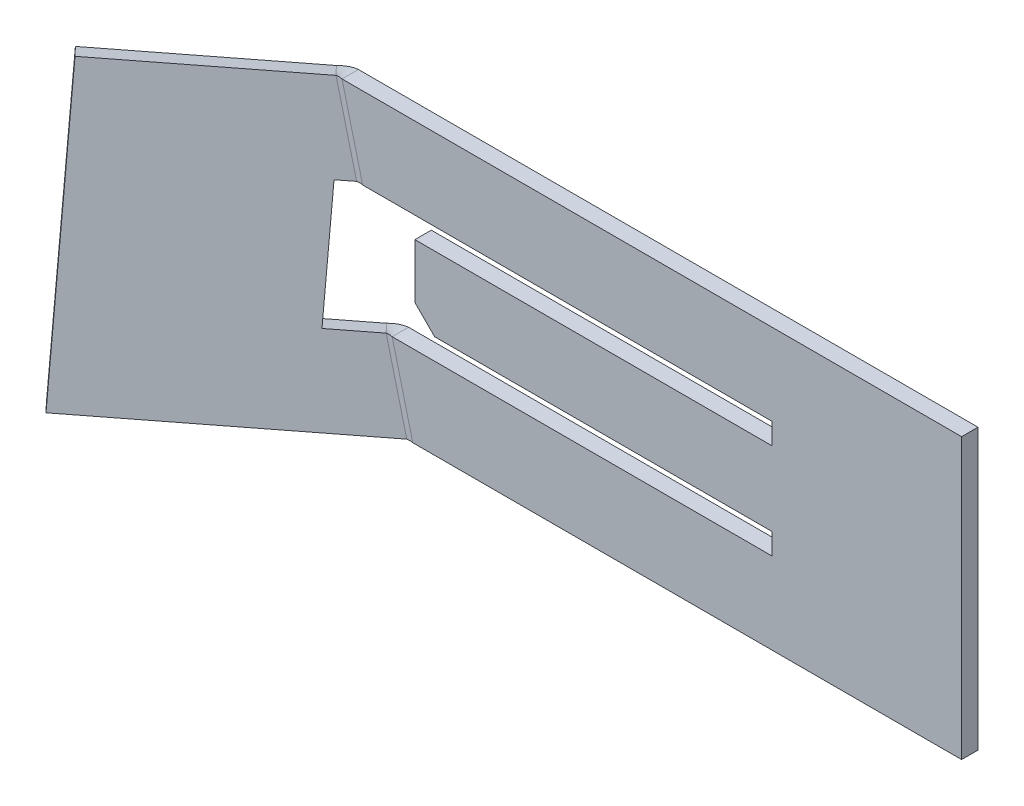
ISO-10303-21;
HEADER;
FILE_DESCRIPTION(('STEP AP214'),'2;1');
FILE_NAME('part.step','',(''),(''),'','','');
FILE_SCHEMA(('AUTOMOTIVE_DESIGN { 1 0 10303 214 1 1 1 1 }'));
ENDSEC;
DATA;
#1=APPLICATION_CONTEXT('core data for automotive mechanical design processes');
#2=APPLICATION_PROTOCOL_DEFINITION('international standard','automotive_design',2000,#1);
#3=PRODUCT_CONTEXT('',#1,'mechanical');
#4=PRODUCT('Part','Part','',(#3));
#5=PRODUCT_RELATED_PRODUCT_CATEGORY('part','',(#4));
#6=PRODUCT_DEFINITION_FORMATION('','',#4);
#7=PRODUCT_DEFINITION_CONTEXT('part definition',#1,'design');
#8=PRODUCT_DEFINITION('design','',#6,#7);
#9=PRODUCT_DEFINITION_SHAPE('','',#8);
#10=(LENGTH_UNIT() NAMED_UNIT(*) SI_UNIT(.MILLI.,.METRE.));
#11=(NAMED_UNIT(*) PLANE_ANGLE_UNIT() SI_UNIT($,.RADIAN.));
#12=(NAMED_UNIT(*) SI_UNIT($,.STERADIAN.) SOLID_ANGLE_UNIT());
#13=UNCERTAINTY_MEASURE_WITH_UNIT(LENGTH_MEASURE(1.E-05),#10,'distance_accuracy_value','');
#14=(GEOMETRIC_REPRESENTATION_CONTEXT(3) GLOBAL_UNCERTAINTY_ASSIGNED_CONTEXT((#13)) GLOBAL_UNIT_ASSIGNED_CONTEXT((#10,
#11,#12)) REPRESENTATION_CONTEXT('',''));
#15=CARTESIAN_POINT('',(0.,0.,0.));
#16=DIRECTION('',(0.,0.,1.));
#17=DIRECTION('',(1.,0.,0.));
#18=AXIS2_PLACEMENT_3D('',#15,#16,#17);
#19=CARTESIAN_POINT('',(45.5954464902255,-32.9383531907822,-72.0643373442726));
#20=DIRECTION('',(0.0696483479716061,-0.98237775564722,0.17344466793291));
#21=DIRECTION('',(-0.685504884859068,-0.17344466793291,-0.707106781186546));
#22=AXIS2_PLACEMENT_3D('',#19,#20,#21);
#23=PLANE('',#22);
#24=DIRECTION('',(0.724729025539327,-0.0696483479716061,-0.685504884859068));
#25=VECTOR('',#24,1.);
#26=CARTESIAN_POINT('',(45.5954464902255,-32.9383531907822,-72.0643373442726));
#27=LINE('',#26,#25);
#28=CARTESIAN_POINT('',(-62.5889850948799,-22.5415473907901,30.264883238693));
#29=VERTEX_POINT('',#28);
#30=CARTESIAN_POINT('',(-28.6593165254018,-25.8022769597896,-1.82842712474618));
#31=VERTEX_POINT('',#30);
#32=EDGE_CURVE('E683',#29,#31,#27,.T.);
#33=ORIENTED_EDGE('',*,*,#32,.T.);
#34=CARTESIAN_POINT('',(-26.6028018708245,-25.2819429559909,0.29289321881346));
#35=CARTESIAN_POINT('',(-28.6593165254018,-25.8022769597896,-1.82842712474616));
#36=B_SPLINE_CURVE_WITH_KNOTS('',1,(#34,#35),.UNSPECIFIED.,.F.,.F.,(2,2),(0.,1.),.UNSPECIFIED.);
#37=CARTESIAN_POINT('',(-26.6028018708246,-25.2819429559909,0.292893218813456));
#38=VERTEX_POINT('',#37);
#39=EDGE_CURVE('E247',#31,#38,#36,.F.);
#40=ORIENTED_EDGE('',*,*,#39,.T.);
#41=DIRECTION('',(0.724729025539327,-0.0696483479716061,-0.685504884859068));
#42=VECTOR('',#41,1.);
#43=CARTESIAN_POINT('',(47.6519611448028,-32.4180191869834,-69.943017000713));
#44=LINE('',#43,#42);
#45=CARTESIAN_POINT('',(-60.5324704403027,-22.0212133869914,32.3862035822526));
#46=VERTEX_POINT('',#45);
#47=EDGE_CURVE('E235',#46,#38,#44,.T.);
#48=ORIENTED_EDGE('',*,*,#47,.F.);
#49=DIRECTION('',(0.685504884859068,0.17344466793291,0.707106781186546));
#50=VECTOR('',#49,1.);
#51=CARTESIAN_POINT('',(-62.5889850948799,-22.5415473907901,30.264883238693));
#52=LINE('',#51,#50);
#53=EDGE_CURVE('E685',#29,#46,#52,.T.);
#54=ORIENTED_EDGE('',*,*,#53,.F.);
#55=EDGE_LOOP('',(#33,#40,#48,#54));
#56=FACE_BOUND('',#55,.T.);
#57=ADVANCED_FACE('F69',(#56),#23,.T.);
#58=CARTESIAN_POINT('',(42.0308273587997,17.3399756433038,-80.941276992712));
#59=DIRECTION('',(-0.0696483479716061,0.98237775564722,-0.17344466793291));
#60=DIRECTION('',(0.685504884859068,0.17344466793291,0.707106781186546));
#61=AXIS2_PLACEMENT_3D('',#58,#59,#60);
#62=PLANE('',#61);
#63=DIRECTION('',(-0.724729025539327,0.0696483479716061,0.685504884859068));
#64=VECTOR('',#63,1.);
#65=CARTESIAN_POINT('',(44.0873420133769,17.8603096471025,-78.8199566491523));
#66=LINE('',#65,#64);
#67=CARTESIAN_POINT('',(-39.5522933252354,25.8982965649672,0.292893218813449));
#68=VERTEX_POINT('',#67);
#69=CARTESIAN_POINT('',(-64.0970895717285,28.2571154470945,23.5092639338132));
#70=VERTEX_POINT('',#69);
#71=EDGE_CURVE('E95',#68,#70,#66,.T.);
#72=ORIENTED_EDGE('',*,*,#71,.F.);
#73=CARTESIAN_POINT('',(-41.6088079798126,25.3779625611684,-1.82842712474618));
#74=CARTESIAN_POINT('',(-39.5522933252354,25.8982965649672,0.292893218813455));
#75=B_SPLINE_CURVE_WITH_KNOTS('',1,(#73,#74),.UNSPECIFIED.,.F.,.F.,(2,2),(0.,1.),.UNSPECIFIED.);
#76=CARTESIAN_POINT('',(-41.6088079798126,25.3779625611684,-1.82842712474618));
#77=VERTEX_POINT('',#76);
#78=EDGE_CURVE('E213',#68,#77,#75,.F.);
#79=ORIENTED_EDGE('',*,*,#78,.T.);
#80=DIRECTION('',(-0.724729025539327,0.0696483479716061,0.685504884859068));
#81=VECTOR('',#80,1.);
#82=CARTESIAN_POINT('',(42.0308273587997,17.3399756433038,-80.941276992712));
#83=LINE('',#82,#81);
#84=CARTESIAN_POINT('',(-66.1536042263057,27.7367814432958,21.3879435902536));
#85=VERTEX_POINT('',#84);
#86=EDGE_CURVE('E217',#77,#85,#83,.T.);
#87=ORIENTED_EDGE('',*,*,#86,.T.);
#88=DIRECTION('',(0.685504884859068,0.17344466793291,0.707106781186546));
#89=VECTOR('',#88,1.);
#90=CARTESIAN_POINT('',(-66.1536042263057,27.7367814432958,21.3879435902536));
#91=LINE('',#90,#89);
#92=EDGE_CURVE('E688',#85,#70,#91,.T.);
#93=ORIENTED_EDGE('',*,*,#92,.T.);
#94=EDGE_LOOP('',(#72,#79,#87,#93));
#95=FACE_BOUND('',#94,.T.);
#96=ADVANCED_FACE('F216',(#95),#62,.T.);
#97=CARTESIAN_POINT('',(-8.22256421346288,-2.08045186994445,-23.2168765334499));
#98=DIRECTION('',(0.685504884859068,0.17344466793291,0.707106781186546));
#99=DIRECTION('',(0.724729025539327,-0.0696483479716061,-0.685504884859068));
#100=AXIS2_PLACEMENT_3D('',#97,#98,#99);
#101=PLANE('',#100);
#102=ORIENTED_EDGE('',*,*,#47,.T.);
#103=DIRECTION('',(-0.245287801712019,0.969450305240699,0.));
#104=VECTOR('',#103,1.);
#105=CARTESIAN_POINT('',(-31.014117675933,-7.84711161123281,0.292893218813463));
#106=LINE('',#105,#104);
#107=CARTESIAN_POINT('',(-30.377319131409,-10.3639287503518,0.292893218813452));
#108=VERTEX_POINT('',#107);
#109=EDGE_CURVE('E712',#38,#108,#106,.T.);
#110=ORIENTED_EDGE('',*,*,#109,.T.);
#111=DIRECTION('',(0.724729025539327,-0.0696483479716061,-0.685504884859068));
#112=VECTOR('',#111,1.);
#113=CARTESIAN_POINT('',(21.4565884000965,-15.3453023413926,-48.7356340817702));
#114=LINE('',#113,#112);
#115=CARTESIAN_POINT('',(-36.4151277844758,-9.783679604484,6.00392062307883));
#116=VERTEX_POINT('',#115);
#117=EDGE_CURVE('E696',#116,#108,#114,.T.);
#118=ORIENTED_EDGE('',*,*,#117,.F.);
#119=DIRECTION('',(0.0696483479716061,-0.98237775564722,0.17344466793291));
#120=VECTOR('',#119,1.);
#121=CARTESIAN_POINT('',(-36.4151277844758,-9.783679604484,6.00392062307883));
#122=LINE('',#121,#120);
#123=CARTESIAN_POINT('',(-37.9017168270222,11.1843986015037,2.30188101487048));
#124=VERTEX_POINT('',#123);
#125=EDGE_CURVE('E664',#124,#116,#122,.T.);
#126=ORIENTED_EDGE('',*,*,#125,.F.);
#127=DIRECTION('',(-0.724729025539327,0.0696483479716061,0.685504884859068));
#128=VECTOR('',#127,1.);
#129=CARTESIAN_POINT('',(19.9699993575501,5.6227758645951,-52.4376736899786));
#130=LINE('',#129,#128);
#131=CARTESIAN_POINT('',(-35.777776064651,10.980282359328,0.292893218813456));
#132=VERTEX_POINT('',#131);
#133=EDGE_CURVE('E87',#132,#124,#130,.T.);
#134=ORIENTED_EDGE('',*,*,#133,.F.);
#135=DIRECTION('',(-0.245287801712019,0.969450305240699,0.));
#136=VECTOR('',#135,1.);
#137=CARTESIAN_POINT('',(-31.014117675933,-7.84711161123281,0.292893218813463));
#138=LINE('',#137,#136);
#139=EDGE_CURVE('E80',#132,#68,#138,.T.);
#140=ORIENTED_EDGE('',*,*,#139,.T.);
#141=ORIENTED_EDGE('',*,*,#71,.T.);
#142=DIRECTION('',(0.0696483479716061,-0.98237775564722,0.17344466793291));
#143=VECTOR('',#142,1.);
#144=CARTESIAN_POINT('',(-60.5324704403027,-22.0212133869914,32.3862035822526));
#145=LINE('',#144,#143);
#146=EDGE_CURVE('E667',#70,#46,#145,.T.);
#147=ORIENTED_EDGE('',*,*,#146,.T.);
#148=EDGE_LOOP('',(#102,#110,#118,#126,#134,#140,#141,#147));
#149=FACE_BOUND('',#148,.T.);
#150=ADVANCED_FACE('F641',(#149),#101,.T.);
#151=CARTESIAN_POINT('',(-62.5889850948799,-22.5415473907901,30.264883238693));
#152=DIRECTION('',(-0.724729025539327,0.0696483479716061,0.685504884859068));
#153=DIRECTION('',(0.685504884859068,0.17344466793291,0.707106781186546));
#154=AXIS2_PLACEMENT_3D('',#151,#152,#153);
#155=PLANE('',#154);
#156=ORIENTED_EDGE('',*,*,#146,.F.);
#157=ORIENTED_EDGE('',*,*,#92,.F.);
#158=DIRECTION('',(0.0696483479716061,-0.98237775564722,0.17344466793291));
#159=VECTOR('',#158,1.);
#160=CARTESIAN_POINT('',(-62.5889850948799,-22.5415473907901,30.264883238693));
#161=LINE('',#160,#159);
#162=EDGE_CURVE('E234',#85,#29,#161,.T.);
#163=ORIENTED_EDGE('',*,*,#162,.T.);
#164=ORIENTED_EDGE('',*,*,#53,.T.);
#165=EDGE_LOOP('',(#156,#157,#163,#164));
#166=FACE_BOUND('',#165,.T.);
#167=ADVANCED_FACE('F638',(#166),#155,.T.);
#168=CARTESIAN_POINT('',(-10.2790788680401,-2.60078587374318,-25.3381968770095));
#169=DIRECTION('',(0.685504884859068,0.17344466793291,0.707106781186546));
#170=DIRECTION('',(0.724729025539327,-0.0696483479716061,-0.685504884859068));
#171=AXIS2_PLACEMENT_3D('',#168,#169,#170);
#172=PLANE('',#171);
#173=DIRECTION('',(-0.245287801712019,0.969450305240699,0.));
#174=VECTOR('',#173,1.);
#175=CARTESIAN_POINT('',(-33.0706323305103,-8.36744561503154,-1.82842712474618));
#176=LINE('',#175,#174);
#177=CARTESIAN_POINT('',(-32.4338337859862,-10.8842627541505,-1.82842712474616));
#178=VERTEX_POINT('',#177);
#179=EDGE_CURVE('E687',#31,#178,#176,.T.);
#180=ORIENTED_EDGE('',*,*,#179,.F.);
#181=ORIENTED_EDGE('',*,*,#32,.F.);
#182=ORIENTED_EDGE('',*,*,#162,.F.);
#183=ORIENTED_EDGE('',*,*,#86,.F.);
#184=DIRECTION('',(-0.245287801712019,0.969450305240699,0.));
#185=VECTOR('',#184,1.);
#186=CARTESIAN_POINT('',(-33.0706323305103,-8.36744561503154,-1.82842712474618));
#187=LINE('',#186,#185);
#188=CARTESIAN_POINT('',(-37.8342907192282,10.4599483555293,-1.82842712474618));
#189=VERTEX_POINT('',#188);
#190=EDGE_CURVE('E224',#189,#77,#187,.T.);
#191=ORIENTED_EDGE('',*,*,#190,.F.);
#192=DIRECTION('',(-0.724729025539327,0.0696483479716061,0.685504884859068));
#193=VECTOR('',#192,1.);
#194=CARTESIAN_POINT('',(17.9134847029729,5.10244186079637,-54.5589940335382));
#195=LINE('',#194,#193);
#196=CARTESIAN_POINT('',(-39.9582314815994,10.664064597705,0.180560671310843));
#197=VERTEX_POINT('',#196);
#198=EDGE_CURVE('E694',#189,#197,#195,.T.);
#199=ORIENTED_EDGE('',*,*,#198,.T.);
#200=DIRECTION('',(0.0696483479716061,-0.98237775564722,0.17344466793291));
#201=VECTOR('',#200,1.);
#202=CARTESIAN_POINT('',(-38.471642439053,-10.3040136082827,3.88260027951919));
#203=LINE('',#202,#201);
#204=CARTESIAN_POINT('',(-38.471642439053,-10.3040136082827,3.88260027951919));
#205=VERTEX_POINT('',#204);
#206=EDGE_CURVE('E695',#197,#205,#203,.T.);
#207=ORIENTED_EDGE('',*,*,#206,.T.);
#208=DIRECTION('',(0.724729025539327,-0.0696483479716061,-0.685504884859068));
#209=VECTOR('',#208,1.);
#210=CARTESIAN_POINT('',(19.4000737455193,-15.8656363451913,-50.8569544253299));
#211=LINE('',#210,#209);
#212=EDGE_CURVE('E678',#205,#178,#211,.T.);
#213=ORIENTED_EDGE('',*,*,#212,.T.);
#214=EDGE_LOOP('',(#180,#181,#182,#183,#191,#199,#207,#213));
#215=FACE_BOUND('',#214,.T.);
#216=ADVANCED_FACE('F230',(#215),#172,.F.);
#217=CARTESIAN_POINT('',(19.4000737455193,-15.8656363451913,-50.8569544253299));
#218=DIRECTION('',(0.0696483479716061,-0.98237775564722,0.17344466793291));
#219=DIRECTION('',(-0.685504884859068,-0.17344466793291,-0.707106781186546));
#220=AXIS2_PLACEMENT_3D('',#217,#218,#219);
#221=PLANE('',#220);
#222=CARTESIAN_POINT('',(-32.4338337859862,-10.8842627541505,-1.82842712474617));
#223=CARTESIAN_POINT('',(-30.377319131409,-10.3639287503518,0.292893218813458));
#224=B_SPLINE_CURVE_WITH_KNOTS('',1,(#222,#223),.UNSPECIFIED.,.F.,.F.,(2,2),(0.,1.),.UNSPECIFIED.);
#225=EDGE_CURVE('E709',#178,#108,#224,.T.);
#226=ORIENTED_EDGE('',*,*,#225,.F.);
#227=ORIENTED_EDGE('',*,*,#212,.F.);
#228=DIRECTION('',(0.685504884859068,0.17344466793291,0.707106781186546));
#229=VECTOR('',#228,1.);
#230=CARTESIAN_POINT('',(-38.471642439053,-10.3040136082827,3.88260027951919));
#231=LINE('',#230,#229);
#232=EDGE_CURVE('E668',#205,#116,#231,.T.);
#233=ORIENTED_EDGE('',*,*,#232,.T.);
#234=ORIENTED_EDGE('',*,*,#117,.T.);
#235=EDGE_LOOP('',(#226,#227,#233,#234));
#236=FACE_BOUND('',#235,.T.);
#237=ADVANCED_FACE('F636',(#236),#221,.F.);
#238=CARTESIAN_POINT('',(-38.471642439053,-10.3040136082827,3.88260027951919));
#239=DIRECTION('',(-0.724729025539327,0.0696483479716061,0.685504884859068));
#240=DIRECTION('',(0.685504884859068,0.17344466793291,0.707106781186546));
#241=AXIS2_PLACEMENT_3D('',#238,#239,#240);
#242=PLANE('',#241);
#243=ORIENTED_EDGE('',*,*,#125,.T.);
#244=ORIENTED_EDGE('',*,*,#232,.F.);
#245=ORIENTED_EDGE('',*,*,#206,.F.);
#246=DIRECTION('',(0.685504884859068,0.17344466793291,0.707106781186546));
#247=VECTOR('',#246,1.);
#248=CARTESIAN_POINT('',(-39.9582314815994,10.664064597705,0.180560671310843));
#249=LINE('',#248,#247);
#250=EDGE_CURVE('E672',#197,#124,#249,.T.);
#251=ORIENTED_EDGE('',*,*,#250,.T.);
#252=EDGE_LOOP('',(#243,#244,#245,#251));
#253=FACE_BOUND('',#252,.T.);
#254=ADVANCED_FACE('F632',(#253),#242,.F.);
#255=CARTESIAN_POINT('',(17.9134847029729,5.10244186079637,-54.5589940335382));
#256=DIRECTION('',(-0.0696483479716061,0.98237775564722,-0.17344466793291));
#257=DIRECTION('',(0.685504884859068,0.17344466793291,0.707106781186546));
#258=AXIS2_PLACEMENT_3D('',#255,#256,#257);
#259=PLANE('',#258);
#260=CARTESIAN_POINT('',(-35.7777760646509,10.980282359328,0.292893218813459));
#261=CARTESIAN_POINT('',(-37.8342907192282,10.4599483555293,-1.82842712474616));
#262=B_SPLINE_CURVE_WITH_KNOTS('',1,(#260,#261),.UNSPECIFIED.,.F.,.F.,(2,2),(0.,1.),.UNSPECIFIED.);
#263=EDGE_CURVE('E12',#132,#189,#262,.T.);
#264=ORIENTED_EDGE('',*,*,#263,.F.);
#265=ORIENTED_EDGE('',*,*,#133,.T.);
#266=ORIENTED_EDGE('',*,*,#250,.F.);
#267=ORIENTED_EDGE('',*,*,#198,.F.);
#268=EDGE_LOOP('',(#264,#265,#266,#267));
#269=FACE_BOUND('',#268,.T.);
#270=ADVANCED_FACE('F635',(#269),#259,.F.);
#271=CARTESIAN_POINT('',(74.6378493013972,-25.590119760479,-3.));
#272=DIRECTION('',(1.,0.,0.));
#273=DIRECTION('',(0.,0.,-1.));
#274=AXIS2_PLACEMENT_3D('',#271,#272,#273);
#275=PLANE('',#274);
#276=DIRECTION('',(0.,1.,0.));
#277=VECTOR('',#276,1.);
#278=CARTESIAN_POINT('',(74.6378493013972,-25.590119760479,0.));
#279=LINE('',#278,#277);
#280=CARTESIAN_POINT('',(74.6378493013972,-25.590119760479,0.));
#281=VERTEX_POINT('',#280);
#282=CARTESIAN_POINT('',(74.6378493013972,25.590119760479,0.));
#283=VERTEX_POINT('',#282);
#284=EDGE_CURVE('E470',#281,#283,#279,.T.);
#285=ORIENTED_EDGE('',*,*,#284,.F.);
#286=DIRECTION('',(0.,0.,1.));
#287=VECTOR('',#286,1.);
#288=CARTESIAN_POINT('',(74.6378493013972,-25.590119760479,-3.));
#289=LINE('',#288,#287);
#290=CARTESIAN_POINT('',(74.6378493013972,-25.590119760479,-3.));
#291=VERTEX_POINT('',#290);
#292=EDGE_CURVE('E465',#291,#281,#289,.T.);
#293=ORIENTED_EDGE('',*,*,#292,.F.);
#294=DIRECTION('',(0.,1.,0.));
#295=VECTOR('',#294,1.);
#296=CARTESIAN_POINT('',(74.6378493013972,-25.590119760479,-3.));
#297=LINE('',#296,#295);
#298=CARTESIAN_POINT('',(74.6378493013972,25.590119760479,-3.));
#299=VERTEX_POINT('',#298);
#300=EDGE_CURVE('E529',#291,#299,#297,.T.);
#301=ORIENTED_EDGE('',*,*,#300,.T.);
#302=DIRECTION('',(0.,0.,1.));
#303=VECTOR('',#302,1.);
#304=CARTESIAN_POINT('',(74.6378493013972,25.590119760479,-3.));
#305=LINE('',#304,#303);
#306=EDGE_CURVE('E527',#299,#283,#305,.T.);
#307=ORIENTED_EDGE('',*,*,#306,.T.);
#308=EDGE_LOOP('',(#285,#293,#301,#307));
#309=FACE_BOUND('',#308,.T.);
#310=ADVANCED_FACE('F414',(#309),#275,.T.);
#311=CARTESIAN_POINT('',(39.9264512287923,6.79196508268892,-3.));
#312=DIRECTION('',(1.,0.,0.));
#313=DIRECTION('',(0.,1.,0.));
#314=AXIS2_PLACEMENT_3D('',#311,#312,#313);
#315=PLANE('',#314);
#316=DIRECTION('',(0.,1.,0.));
#317=VECTOR('',#316,1.);
#318=CARTESIAN_POINT('',(39.9264512287923,6.79196508268892,0.));
#319=LINE('',#318,#317);
#320=CARTESIAN_POINT('',(39.9264512287923,6.79196508268892,0.));
#321=VERTEX_POINT('',#320);
#322=CARTESIAN_POINT('',(39.9264512287924,10.6721055548399,0.));
#323=VERTEX_POINT('',#322);
#324=EDGE_CURVE('E524',#321,#323,#319,.T.);
#325=ORIENTED_EDGE('',*,*,#324,.T.);
#326=DIRECTION('',(0.,0.,1.));
#327=VECTOR('',#326,1.);
#328=CARTESIAN_POINT('',(39.9264512287924,10.6721055548399,-3.));
#329=LINE('',#328,#327);
#330=CARTESIAN_POINT('',(39.9264512287924,10.6721055548399,-3.));
#331=VERTEX_POINT('',#330);
#332=EDGE_CURVE('E458',#331,#323,#329,.T.);
#333=ORIENTED_EDGE('',*,*,#332,.F.);
#334=DIRECTION('',(0.,1.,0.));
#335=VECTOR('',#334,1.);
#336=CARTESIAN_POINT('',(39.9264512287923,6.79196508268892,-3.));
#337=LINE('',#336,#335);
#338=CARTESIAN_POINT('',(39.9264512287923,6.79196508268892,-3.));
#339=VERTEX_POINT('',#338);
#340=EDGE_CURVE('E475',#339,#331,#337,.T.);
#341=ORIENTED_EDGE('',*,*,#340,.F.);
#342=DIRECTION('',(0.,0.,1.));
#343=VECTOR('',#342,1.);
#344=CARTESIAN_POINT('',(39.9264512287923,6.79196508268892,-3.));
#345=LINE('',#344,#343);
#346=EDGE_CURVE('E521',#339,#321,#345,.T.);
#347=ORIENTED_EDGE('',*,*,#346,.T.);
#348=EDGE_LOOP('',(#325,#333,#341,#347));
#349=FACE_BOUND('',#348,.T.);
#350=ADVANCED_FACE('F844',(#349),#315,.F.);
#351=CARTESIAN_POINT('',(39.9264512287923,6.79196508268892,-3.));
#352=DIRECTION('',(0.,-1.,0.));
#353=DIRECTION('',(1.,0.,0.));
#354=AXIS2_PLACEMENT_3D('',#351,#352,#353);
#355=PLANE('',#354);
#356=DIRECTION('',(1.,0.,0.));
#357=VECTOR('',#356,1.);
#358=CARTESIAN_POINT('',(39.9264512287923,6.79196508268892,0.));
#359=LINE('',#358,#357);
#360=CARTESIAN_POINT('',(-25.4100806282466,6.79196508268889,0.));
#361=VERTEX_POINT('',#360);
#362=EDGE_CURVE('E519',#361,#321,#359,.T.);
#363=ORIENTED_EDGE('',*,*,#362,.T.);
#364=ORIENTED_EDGE('',*,*,#346,.F.);
#365=DIRECTION('',(1.,0.,0.));
#366=VECTOR('',#365,1.);
#367=CARTESIAN_POINT('',(39.9264512287923,6.79196508268892,-3.));
#368=LINE('',#367,#366);
#369=CARTESIAN_POINT('',(-25.4100806282466,6.79196508268889,-3.));
#370=VERTEX_POINT('',#369);
#371=EDGE_CURVE('E479',#370,#339,#368,.T.);
#372=ORIENTED_EDGE('',*,*,#371,.F.);
#373=DIRECTION('',(0.,0.,1.));
#374=VECTOR('',#373,1.);
#375=CARTESIAN_POINT('',(-25.4100806282466,6.79196508268889,-3.));
#376=LINE('',#375,#374);
#377=EDGE_CURVE('E517',#370,#361,#376,.T.);
#378=ORIENTED_EDGE('',*,*,#377,.T.);
#379=EDGE_LOOP('',(#363,#364,#372,#378));
#380=FACE_BOUND('',#379,.T.);
#381=ADVANCED_FACE('F850',(#380),#355,.F.);
#382=CARTESIAN_POINT('',(-25.4100806282466,6.79196508268889,-3.));
#383=DIRECTION('',(1.,0.,0.));
#384=DIRECTION('',(0.,0.,-1.));
#385=AXIS2_PLACEMENT_3D('',#382,#383,#384);
#386=PLANE('',#385);
#387=DIRECTION('',(0.,1.,0.));
#388=VECTOR('',#387,1.);
#389=CARTESIAN_POINT('',(-25.4100806282466,6.79196508268889,0.));
#390=LINE('',#389,#388);
#391=CARTESIAN_POINT('',(-25.4100806282466,-3.17731175601577,0.));
#392=VERTEX_POINT('',#391);
#393=EDGE_CURVE('E514',#392,#361,#390,.T.);
#394=ORIENTED_EDGE('',*,*,#393,.T.);
#395=ORIENTED_EDGE('',*,*,#377,.F.);
#396=DIRECTION('',(0.,1.,0.));
#397=VECTOR('',#396,1.);
#398=CARTESIAN_POINT('',(-25.4100806282466,6.79196508268889,-3.));
#399=LINE('',#398,#397);
#400=CARTESIAN_POINT('',(-25.4100806282466,-3.17731175601577,-3.));
#401=VERTEX_POINT('',#400);
#402=EDGE_CURVE('E482',#401,#370,#399,.T.);
#403=ORIENTED_EDGE('',*,*,#402,.F.);
#404=DIRECTION('',(0.,0.,1.));
#405=VECTOR('',#404,1.);
#406=CARTESIAN_POINT('',(-25.4100806282466,-3.17731175601577,-3.));
#407=LINE('',#406,#405);
#408=EDGE_CURVE('E512',#401,#392,#407,.T.);
#409=ORIENTED_EDGE('',*,*,#408,.T.);
#410=EDGE_LOOP('',(#394,#395,#403,#409));
#411=FACE_BOUND('',#410,.T.);
#412=ADVANCED_FACE('F857',(#411),#386,.F.);
#413=CARTESIAN_POINT('',(-21.7954273015734,-6.79196508268893,-3.));
#414=DIRECTION('',(0.707106781186537,0.707106781186558,0.));
#415=DIRECTION('',(-0.707106781186558,0.707106781186537,0.));
#416=AXIS2_PLACEMENT_3D('',#413,#414,#415);
#417=PLANE('',#416);
#418=DIRECTION('',(-0.707106781186558,0.707106781186537,0.));
#419=VECTOR('',#418,1.);
#420=CARTESIAN_POINT('',(-21.7954273015734,-6.79196508268893,0.));
#421=LINE('',#420,#419);
#422=CARTESIAN_POINT('',(-21.7954273015734,-6.79196508268893,0.));
#423=VERTEX_POINT('',#422);
#424=EDGE_CURVE('E509',#423,#392,#421,.T.);
#425=ORIENTED_EDGE('',*,*,#424,.T.);
#426=ORIENTED_EDGE('',*,*,#408,.F.);
#427=DIRECTION('',(-0.707106781186558,0.707106781186537,0.));
#428=VECTOR('',#427,1.);
#429=CARTESIAN_POINT('',(-21.7954273015734,-6.79196508268893,-3.));
#430=LINE('',#429,#428);
#431=CARTESIAN_POINT('',(-21.7954273015734,-6.79196508268893,-3.));
#432=VERTEX_POINT('',#431);
#433=EDGE_CURVE('E485',#432,#401,#430,.T.);
#434=ORIENTED_EDGE('',*,*,#433,.F.);
#435=DIRECTION('',(0.,0.,1.));
#436=VECTOR('',#435,1.);
#437=CARTESIAN_POINT('',(-21.7954273015734,-6.79196508268893,-3.));
#438=LINE('',#437,#436);
#439=EDGE_CURVE('E507',#432,#423,#438,.T.);
#440=ORIENTED_EDGE('',*,*,#439,.T.);
#441=EDGE_LOOP('',(#425,#426,#434,#440));
#442=FACE_BOUND('',#441,.T.);
#443=ADVANCED_FACE('F865',(#442),#417,.F.);
#444=CARTESIAN_POINT('',(39.9264512287923,-6.79196508268892,-3.));
#445=DIRECTION('',(0.,1.,0.));
#446=DIRECTION('',(-1.,0.,0.));
#447=AXIS2_PLACEMENT_3D('',#444,#445,#446);
#448=PLANE('',#447);
#449=DIRECTION('',(-1.,0.,0.));
#450=VECTOR('',#449,1.);
#451=CARTESIAN_POINT('',(39.9264512287923,-6.79196508268892,0.));
#452=LINE('',#451,#450);
#453=CARTESIAN_POINT('',(39.9264512287923,-6.79196508268892,0.));
#454=VERTEX_POINT('',#453);
#455=EDGE_CURVE('E504',#454,#423,#452,.T.);
#456=ORIENTED_EDGE('',*,*,#455,.T.);
#457=ORIENTED_EDGE('',*,*,#439,.F.);
#458=DIRECTION('',(-1.,0.,0.));
#459=VECTOR('',#458,1.);
#460=CARTESIAN_POINT('',(39.9264512287923,-6.79196508268892,-3.));
#461=LINE('',#460,#459);
#462=CARTESIAN_POINT('',(39.9264512287923,-6.79196508268892,-3.));
#463=VERTEX_POINT('',#462);
#464=EDGE_CURVE('E488',#463,#432,#461,.T.);
#465=ORIENTED_EDGE('',*,*,#464,.F.);
#466=DIRECTION('',(0.,0.,1.));
#467=VECTOR('',#466,1.);
#468=CARTESIAN_POINT('',(39.9264512287923,-6.79196508268892,-3.));
#469=LINE('',#468,#467);
#470=EDGE_CURVE('E502',#463,#454,#469,.T.);
#471=ORIENTED_EDGE('',*,*,#470,.T.);
#472=EDGE_LOOP('',(#456,#457,#465,#471));
#473=FACE_BOUND('',#472,.T.);
#474=ADVANCED_FACE('F873',(#473),#448,.F.);
#475=CARTESIAN_POINT('',(39.9264512287924,-10.6721055548399,-3.));
#476=DIRECTION('',(1.,0.,0.));
#477=DIRECTION('',(0.,1.,0.));
#478=AXIS2_PLACEMENT_3D('',#475,#476,#477);
#479=PLANE('',#478);
#480=DIRECTION('',(0.,1.,0.));
#481=VECTOR('',#480,1.);
#482=CARTESIAN_POINT('',(39.9264512287924,-10.6721055548399,0.));
#483=LINE('',#482,#481);
#484=CARTESIAN_POINT('',(39.9264512287924,-10.6721055548399,0.));
#485=VERTEX_POINT('',#484);
#486=EDGE_CURVE('E499',#485,#454,#483,.T.);
#487=ORIENTED_EDGE('',*,*,#486,.T.);
#488=ORIENTED_EDGE('',*,*,#470,.F.);
#489=DIRECTION('',(0.,1.,0.));
#490=VECTOR('',#489,1.);
#491=CARTESIAN_POINT('',(39.9264512287924,-10.6721055548399,-3.));
#492=LINE('',#491,#490);
#493=CARTESIAN_POINT('',(39.9264512287924,-10.6721055548399,-3.));
#494=VERTEX_POINT('',#493);
#495=EDGE_CURVE('E491',#494,#463,#492,.T.);
#496=ORIENTED_EDGE('',*,*,#495,.F.);
#497=DIRECTION('',(0.,0.,1.));
#498=VECTOR('',#497,1.);
#499=CARTESIAN_POINT('',(39.9264512287924,-10.6721055548399,-3.));
#500=LINE('',#499,#498);
#501=EDGE_CURVE('E495',#494,#485,#500,.T.);
#502=ORIENTED_EDGE('',*,*,#501,.T.);
#503=EDGE_LOOP('',(#487,#488,#496,#502));
#504=FACE_BOUND('',#503,.T.);
#505=ADVANCED_FACE('F739',(#504),#479,.F.);
#506=CARTESIAN_POINT('',(0.,0.,-3.));
#507=DIRECTION('',(0.,0.,1.));
#508=DIRECTION('',(1.,0.,0.));
#509=AXIS2_PLACEMENT_3D('',#506,#507,#508);
#510=PLANE('',#509);
#511=DIRECTION('',(1.,0.,0.));
#512=VECTOR('',#511,1.);
#513=CARTESIAN_POINT('',(74.6378493013972,-25.590119760479,-3.));
#514=LINE('',#513,#512);
#515=CARTESIAN_POINT('',(-25.7954383702233,-25.590119760479,-3.));
#516=VERTEX_POINT('',#515);
#517=EDGE_CURVE('E469',#516,#291,#514,.T.);
#518=ORIENTED_EDGE('',*,*,#517,.F.);
#519=DIRECTION('',(-0.245287801712019,0.969450305240699,0.));
#520=VECTOR('',#519,1.);
#521=CARTESIAN_POINT('',(-30.3286127910739,-7.6736669432999,-3.));
#522=LINE('',#521,#520);
#523=CARTESIAN_POINT('',(-29.5699556308078,-10.6721055548399,-3.));
#524=VERTEX_POINT('',#523);
#525=EDGE_CURVE('E498',#516,#524,#522,.T.);
#526=ORIENTED_EDGE('',*,*,#525,.T.);
#527=DIRECTION('',(1.,0.,0.));
#528=VECTOR('',#527,1.);
#529=CARTESIAN_POINT('',(39.9264512287924,-10.6721055548399,-3.));
#530=LINE('',#529,#528);
#531=EDGE_CURVE('E494',#524,#494,#530,.T.);
#532=ORIENTED_EDGE('',*,*,#531,.T.);
#533=ORIENTED_EDGE('',*,*,#495,.T.);
#534=ORIENTED_EDGE('',*,*,#464,.T.);
#535=ORIENTED_EDGE('',*,*,#433,.T.);
#536=ORIENTED_EDGE('',*,*,#402,.T.);
#537=ORIENTED_EDGE('',*,*,#371,.T.);
#538=ORIENTED_EDGE('',*,*,#340,.T.);
#539=DIRECTION('',(-1.,0.,0.));
#540=VECTOR('',#539,1.);
#541=CARTESIAN_POINT('',(39.9264512287924,10.6721055548399,-3.));
#542=LINE('',#541,#540);
#543=CARTESIAN_POINT('',(-34.9704125640497,10.6721055548399,-3.));
#544=VERTEX_POINT('',#543);
#545=EDGE_CURVE('E478',#331,#544,#542,.T.);
#546=ORIENTED_EDGE('',*,*,#545,.T.);
#547=DIRECTION('',(-0.245287801712019,0.969450305240699,0.));
#548=VECTOR('',#547,1.);
#549=CARTESIAN_POINT('',(-30.3286127910739,-7.6736669432999,-3.));
#550=LINE('',#549,#548);
#551=CARTESIAN_POINT('',(-38.7449298246341,25.590119760479,-3.));
#552=VERTEX_POINT('',#551);
#553=EDGE_CURVE('E590',#544,#552,#550,.T.);
#554=ORIENTED_EDGE('',*,*,#553,.T.);
#555=DIRECTION('',(-1.,0.,0.));
#556=VECTOR('',#555,1.);
#557=CARTESIAN_POINT('',(74.6378493013972,25.590119760479,-3.));
#558=LINE('',#557,#556);
#559=EDGE_CURVE('E468',#299,#552,#558,.T.);
#560=ORIENTED_EDGE('',*,*,#559,.F.);
#561=ORIENTED_EDGE('',*,*,#300,.F.);
#562=EDGE_LOOP('',(#518,#526,#532,#533,#534,#535,#536,#537,#538,#546,#554,#560,#561));
#563=FACE_BOUND('',#562,.T.);
#564=ADVANCED_FACE('F559',(#563),#510,.F.);
#565=CARTESIAN_POINT('',(39.9264512287924,-10.6721055548399,-3.));
#566=DIRECTION('',(0.,-1.,0.));
#567=DIRECTION('',(0.,0.,-1.));
#568=AXIS2_PLACEMENT_3D('',#565,#566,#567);
#569=PLANE('',#568);
#570=ORIENTED_EDGE('',*,*,#531,.F.);
#571=CARTESIAN_POINT('',(-29.5699556308078,-10.6721055548399,0.));
#572=CARTESIAN_POINT('',(-29.5699556308078,-10.6721055548399,-3.));
#573=B_SPLINE_CURVE_WITH_KNOTS('',1,(#571,#572),.UNSPECIFIED.,.F.,.F.,(2,2),(0.,1.),.UNSPECIFIED.);
#574=CARTESIAN_POINT('',(-29.5699556308078,-10.6721055548399,0.));
#575=VERTEX_POINT('',#574);
#576=EDGE_CURVE('E454',#524,#575,#573,.F.);
#577=ORIENTED_EDGE('',*,*,#576,.T.);
#578=DIRECTION('',(1.,0.,0.));
#579=VECTOR('',#578,1.);
#580=CARTESIAN_POINT('',(39.9264512287924,-10.6721055548399,0.));
#581=LINE('',#580,#579);
#582=EDGE_CURVE('E536',#575,#485,#581,.T.);
#583=ORIENTED_EDGE('',*,*,#582,.T.);
#584=ORIENTED_EDGE('',*,*,#501,.F.);
#585=EDGE_LOOP('',(#570,#577,#583,#584));
#586=FACE_BOUND('',#585,.T.);
#587=ADVANCED_FACE('F548',(#586),#569,.F.);
#588=CARTESIAN_POINT('',(0.,0.,0.));
#589=DIRECTION('',(0.,0.,1.));
#590=DIRECTION('',(1.,0.,0.));
#591=AXIS2_PLACEMENT_3D('',#588,#589,#590);
#592=PLANE('',#591);
#593=DIRECTION('',(-0.245287801712019,0.969450305240699,0.));
#594=VECTOR('',#593,1.);
#595=CARTESIAN_POINT('',(-30.3286127910739,-7.67366694329991,0.));
#596=LINE('',#595,#594);
#597=CARTESIAN_POINT('',(-25.7954383702233,-25.590119760479,0.));
#598=VERTEX_POINT('',#597);
#599=EDGE_CURVE('E532',#598,#575,#596,.T.);
#600=ORIENTED_EDGE('',*,*,#599,.F.);
#601=DIRECTION('',(1.,0.,0.));
#602=VECTOR('',#601,1.);
#603=CARTESIAN_POINT('',(74.6378493013972,-25.590119760479,0.));
#604=LINE('',#603,#602);
#605=EDGE_CURVE('E474',#598,#281,#604,.T.);
#606=ORIENTED_EDGE('',*,*,#605,.T.);
#607=ORIENTED_EDGE('',*,*,#284,.T.);
#608=DIRECTION('',(-1.,0.,0.));
#609=VECTOR('',#608,1.);
#610=CARTESIAN_POINT('',(74.6378493013972,25.590119760479,0.));
#611=LINE('',#610,#609);
#612=CARTESIAN_POINT('',(-38.7449298246342,25.590119760479,0.));
#613=VERTEX_POINT('',#612);
#614=EDGE_CURVE('E473',#283,#613,#611,.T.);
#615=ORIENTED_EDGE('',*,*,#614,.T.);
#616=DIRECTION('',(-0.245287801712019,0.969450305240699,0.));
#617=VECTOR('',#616,1.);
#618=CARTESIAN_POINT('',(-30.3286127910739,-7.67366694329991,0.));
#619=LINE('',#618,#617);
#620=CARTESIAN_POINT('',(-34.9704125640497,10.6721055548399,0.));
#621=VERTEX_POINT('',#620);
#622=EDGE_CURVE('E601',#621,#613,#619,.T.);
#623=ORIENTED_EDGE('',*,*,#622,.F.);
#624=DIRECTION('',(-1.,0.,0.));
#625=VECTOR('',#624,1.);
#626=CARTESIAN_POINT('',(39.9264512287924,10.6721055548399,0.));
#627=LINE('',#626,#625);
#628=EDGE_CURVE('E587',#323,#621,#627,.T.);
#629=ORIENTED_EDGE('',*,*,#628,.F.);
#630=ORIENTED_EDGE('',*,*,#324,.F.);
#631=ORIENTED_EDGE('',*,*,#362,.F.);
#632=ORIENTED_EDGE('',*,*,#393,.F.);
#633=ORIENTED_EDGE('',*,*,#424,.F.);
#634=ORIENTED_EDGE('',*,*,#455,.F.);
#635=ORIENTED_EDGE('',*,*,#486,.F.);
#636=ORIENTED_EDGE('',*,*,#582,.F.);
#637=EDGE_LOOP('',(#600,#606,#607,#615,#623,#629,#630,#631,#632,#633,#634,#635,#636));
#638=FACE_BOUND('',#637,.T.);
#639=ADVANCED_FACE('F558',(#638),#592,.T.);
#640=CARTESIAN_POINT('',(74.6378493013972,-25.590119760479,-3.));
#641=DIRECTION('',(0.,-1.,0.));
#642=DIRECTION('',(0.,0.,-1.));
#643=AXIS2_PLACEMENT_3D('',#640,#641,#642);
#644=PLANE('',#643);
#645=CARTESIAN_POINT('',(-25.7954383702233,-25.590119760479,-3.));
#646=CARTESIAN_POINT('',(-25.7954383702233,-25.590119760479,0.));
#647=B_SPLINE_CURVE_WITH_KNOTS('',1,(#645,#646),.UNSPECIFIED.,.F.,.F.,(2,2),(0.,1.),.UNSPECIFIED.);
#648=EDGE_CURVE('E440',#516,#598,#647,.T.);
#649=ORIENTED_EDGE('',*,*,#648,.F.);
#650=ORIENTED_EDGE('',*,*,#517,.T.);
#651=ORIENTED_EDGE('',*,*,#292,.T.);
#652=ORIENTED_EDGE('',*,*,#605,.F.);
#653=EDGE_LOOP('',(#649,#650,#651,#652));
#654=FACE_BOUND('',#653,.T.);
#655=ADVANCED_FACE('F563',(#654),#644,.T.);
#656=CARTESIAN_POINT('',(74.6378493013972,25.590119760479,-3.));
#657=DIRECTION('',(0.,1.,0.));
#658=DIRECTION('',(0.,0.,1.));
#659=AXIS2_PLACEMENT_3D('',#656,#657,#658);
#660=PLANE('',#659);
#661=CARTESIAN_POINT('',(-38.7449298246341,25.590119760479,0.));
#662=CARTESIAN_POINT('',(-38.7449298246341,25.590119760479,-3.));
#663=B_SPLINE_CURVE_WITH_KNOTS('',1,(#661,#662),.UNSPECIFIED.,.F.,.F.,(2,2),(0.,1.),.UNSPECIFIED.);
#664=EDGE_CURVE('E253',#613,#552,#663,.T.);
#665=ORIENTED_EDGE('',*,*,#664,.F.);
#666=ORIENTED_EDGE('',*,*,#614,.F.);
#667=ORIENTED_EDGE('',*,*,#306,.F.);
#668=ORIENTED_EDGE('',*,*,#559,.T.);
#669=EDGE_LOOP('',(#665,#666,#667,#668));
#670=FACE_BOUND('',#669,.T.);
#671=ADVANCED_FACE('F568',(#670),#660,.T.);
#672=CARTESIAN_POINT('',(39.9264512287924,10.6721055548399,-3.));
#673=DIRECTION('',(0.,1.,0.));
#674=DIRECTION('',(0.,0.,1.));
#675=AXIS2_PLACEMENT_3D('',#672,#673,#674);
#676=PLANE('',#675);
#677=ORIENTED_EDGE('',*,*,#628,.T.);
#678=CARTESIAN_POINT('',(-34.9704125640497,10.6721055548399,-3.));
#679=CARTESIAN_POINT('',(-34.9704125640497,10.6721055548399,0.));
#680=B_SPLINE_CURVE_WITH_KNOTS('',1,(#678,#679),.UNSPECIFIED.,.F.,.F.,(2,2),(0.,1.),.UNSPECIFIED.);
#681=EDGE_CURVE('E322',#621,#544,#680,.F.);
#682=ORIENTED_EDGE('',*,*,#681,.T.);
#683=ORIENTED_EDGE('',*,*,#545,.F.);
#684=ORIENTED_EDGE('',*,*,#332,.T.);
#685=EDGE_LOOP('',(#677,#682,#683,#684));
#686=FACE_BOUND('',#685,.T.);
#687=ADVANCED_FACE('F410',(#686),#676,.F.);
#688=CARTESIAN_POINT('',(-25.7954383702233,-25.590119760479,-3.));
#689=CARTESIAN_POINT('',(-26.3234439914509,-25.6382903793749,-3.));
#690=CARTESIAN_POINT('',(-26.8510641743569,-25.6863935223011,-2.89589070667326));
#691=CARTESIAN_POINT('',(-27.8296117443671,-25.7631651492475,-2.49514555341702));
#692=CARTESIAN_POINT('',(-28.2800105300771,-25.7917299345488,-2.19873249432926));
#693=CARTESIAN_POINT('',(-28.6593165254018,-25.8022769597896,-1.82842712474616));
#694=CARTESIAN_POINT('',(-25.7954383702233,-25.590119760479,0.));
#695=CARTESIAN_POINT('',(-25.9426678445388,-25.5419514112271,0.));
#696=CARTESIAN_POINT('',(-26.0898094751922,-25.4937828328293,0.0260273233316848));
#697=CARTESIAN_POINT('',(-26.3649110216303,-25.3925703714606,0.126213611645745));
#698=CARTESIAN_POINT('',(-26.4927455514233,-25.339516760481,0.20032123831583));
#699=CARTESIAN_POINT('',(-26.6028018708245,-25.2819429559909,0.29289321881346));
#700=B_SPLINE_SURFACE_WITH_KNOTS('',1,3,((#688,#689,#690,#691,#692,#693),(#694,#695,#696,#697,
#698,#699)),.UNSPECIFIED.,.F.,.F.,.F.,(2,2),(4,2,4),(0.,1.),(0.,0.5,1.),.UNSPECIFIED.);
#701=CARTESIAN_POINT('',(-25.7954383702233,-25.590119760479,0.));
#702=CARTESIAN_POINT('',(-25.9426678445388,-25.5419514112271,0.));
#703=CARTESIAN_POINT('',(-26.0898094751922,-25.4937828328293,0.0260273233316848));
#704=CARTESIAN_POINT('',(-26.3649110216303,-25.3925703714606,0.126213611645745));
#705=CARTESIAN_POINT('',(-26.4927455514233,-25.339516760481,0.20032123831583));
#706=CARTESIAN_POINT('',(-26.6028018708245,-25.2819429559909,0.29289321881346));
#707=B_SPLINE_CURVE_WITH_KNOTS('',3,(#701,#702,#703,#704,#705,#706),.UNSPECIFIED.,.F.,.F.,(4,2,
4),(0.,0.5,1.),.UNSPECIFIED.);
#708=EDGE_CURVE('E256',#598,#38,#707,.T.);
#709=CARTESIAN_POINT('',(-28.6593165254018,-25.8022769597896,-1.82842712474616));
#710=CARTESIAN_POINT('',(-28.2800105300771,-25.7917299345488,-2.19873249432926));
#711=CARTESIAN_POINT('',(-27.8296117443671,-25.7631651492475,-2.49514555341702));
#712=CARTESIAN_POINT('',(-26.8510641743569,-25.6863935223011,-2.89589070667326));
#713=CARTESIAN_POINT('',(-26.3234439914509,-25.6382903793749,-3.));
#714=CARTESIAN_POINT('',(-25.7954383702233,-25.590119760479,-3.));
#715=B_SPLINE_CURVE_WITH_KNOTS('',3,(#709,#710,#711,#712,#713,#714),.UNSPECIFIED.,.F.,.F.,(4,2,
4),(0.,0.5,1.),.UNSPECIFIED.);
#716=EDGE_CURVE('E376',#516,#31,#715,.F.);
#717=ORIENTED_EDGE('',*,*,#648,.T.);
#718=ORIENTED_EDGE('',*,*,#708,.T.);
#719=ORIENTED_EDGE('',*,*,#39,.F.);
#720=ORIENTED_EDGE('',*,*,#716,.F.);
#721=EDGE_LOOP('',(#717,#718,#719,#720));
#722=FACE_BOUND('',#721,.T.);
#723=ADVANCED_FACE('F399',(#722),#700,.T.);
#724=CARTESIAN_POINT('',(-32.4338337859862,-10.8842627541505,-1.82842712474617));
#725=CARTESIAN_POINT('',(-32.0545277906615,-10.8737157289097,-2.19873249432927));
#726=CARTESIAN_POINT('',(-31.6041290049516,-10.8451509436084,-2.49514555341702));
#727=CARTESIAN_POINT('',(-30.6255814349414,-10.7683793166619,-2.89589070667326));
#728=CARTESIAN_POINT('',(-30.0979612520354,-10.7202761737357,-3.));
#729=CARTESIAN_POINT('',(-29.5699556308078,-10.6721055548399,-3.));
#730=CARTESIAN_POINT('',(-30.377319131409,-10.3639287503518,0.292893218813458));
#731=CARTESIAN_POINT('',(-30.2672628120078,-10.4215025548419,0.200321238315819));
#732=CARTESIAN_POINT('',(-30.1394282822148,-10.4745561658215,0.126213611645744));
#733=CARTESIAN_POINT('',(-29.8643267357767,-10.5757686271902,0.026027323331685));
#734=CARTESIAN_POINT('',(-29.7171851051232,-10.623937205588,0.));
#735=CARTESIAN_POINT('',(-29.5699556308078,-10.6721055548399,0.));
#736=B_SPLINE_SURFACE_WITH_KNOTS('',1,3,((#724,#725,#726,#727,#728,#729),(#730,#731,#732,#733,
#734,#735)),.UNSPECIFIED.,.F.,.F.,.F.,(2,2),(4,2,4),(0.,1.),(0.,0.5,1.),.UNSPECIFIED.);
#737=CARTESIAN_POINT('',(-30.377319131409,-10.3639287503518,0.292893218813458));
#738=CARTESIAN_POINT('',(-30.2672628120078,-10.4215025548419,0.200321238315819));
#739=CARTESIAN_POINT('',(-30.1394282822148,-10.4745561658215,0.126213611645744));
#740=CARTESIAN_POINT('',(-29.8643267357767,-10.5757686271902,0.026027323331685));
#741=CARTESIAN_POINT('',(-29.7171851051232,-10.623937205588,0.));
#742=CARTESIAN_POINT('',(-29.5699556308078,-10.6721055548399,0.));
#743=B_SPLINE_CURVE_WITH_KNOTS('',3,(#737,#738,#739,#740,#741,#742),.UNSPECIFIED.,.F.,.F.,(4,2,
4),(0.,0.5,1.),.UNSPECIFIED.);
#744=EDGE_CURVE('E731',#108,#575,#743,.T.);
#745=CARTESIAN_POINT('',(-29.5699556308078,-10.6721055548399,-3.));
#746=CARTESIAN_POINT('',(-30.0979612520354,-10.7202761737357,-3.));
#747=CARTESIAN_POINT('',(-30.6255814349414,-10.7683793166619,-2.89589070667326));
#748=CARTESIAN_POINT('',(-31.6041290049516,-10.8451509436084,-2.49514555341702));
#749=CARTESIAN_POINT('',(-32.0545277906615,-10.8737157289097,-2.19873249432927));
#750=CARTESIAN_POINT('',(-32.4338337859862,-10.8842627541505,-1.82842712474617));
#751=B_SPLINE_CURVE_WITH_KNOTS('',3,(#745,#746,#747,#748,#749,#750),.UNSPECIFIED.,.F.,.F.,(4,2,
4),(0.,0.5,1.),.UNSPECIFIED.);
#752=EDGE_CURVE('E609',#178,#524,#751,.F.);
#753=ORIENTED_EDGE('',*,*,#225,.T.);
#754=ORIENTED_EDGE('',*,*,#744,.T.);
#755=ORIENTED_EDGE('',*,*,#576,.F.);
#756=ORIENTED_EDGE('',*,*,#752,.F.);
#757=EDGE_LOOP('',(#753,#754,#755,#756));
#758=FACE_BOUND('',#757,.T.);
#759=ADVANCED_FACE('F354',(#758),#736,.T.);
#760=CARTESIAN_POINT('',(-23.6883010307429,-33.9181528819208,1.));
#761=DIRECTION('',(-0.245287801712019,0.969450305240699,0.));
#762=DIRECTION('',(-0.969450305240699,-0.245287801712019,0.));
#763=AXIS2_PLACEMENT_3D('',#760,#761,#762);
#764=CYLINDRICAL_SURFACE('',#763,4.);
#765=ORIENTED_EDGE('',*,*,#752,.T.);
#766=ORIENTED_EDGE('',*,*,#525,.F.);
#767=ORIENTED_EDGE('',*,*,#716,.T.);
#768=ORIENTED_EDGE('',*,*,#179,.T.);
#769=EDGE_LOOP('',(#765,#766,#767,#768));
#770=FACE_BOUND('',#769,.T.);
#771=ADVANCED_FACE('F344',(#770),#764,.T.);
#772=CARTESIAN_POINT('',(-23.6883010307429,-33.9181528819208,1.));
#773=DIRECTION('',(-0.245287801712019,0.969450305240699,0.));
#774=DIRECTION('',(-0.969450305240699,-0.245287801712019,0.));
#775=AXIS2_PLACEMENT_3D('',#772,#773,#774);
#776=CYLINDRICAL_SURFACE('',#775,1.);
#777=ORIENTED_EDGE('',*,*,#744,.F.);
#778=ORIENTED_EDGE('',*,*,#109,.F.);
#779=ORIENTED_EDGE('',*,*,#708,.F.);
#780=ORIENTED_EDGE('',*,*,#599,.T.);
#781=EDGE_LOOP('',(#777,#778,#779,#780));
#782=FACE_BOUND('',#781,.T.);
#783=ADVANCED_FACE('F353',(#782),#776,.F.);
#784=CARTESIAN_POINT('',(-34.9704125640497,10.6721055548399,-3.));
#785=CARTESIAN_POINT('',(-35.4984181852773,10.6239349359441,-3.));
#786=CARTESIAN_POINT('',(-36.0260383681833,10.5758317930179,-2.89589070667326));
#787=CARTESIAN_POINT('',(-37.0045859381935,10.4990601660714,-2.49514555341702));
#788=CARTESIAN_POINT('',(-37.4549847239034,10.4704953807701,-2.19873249432926));
#789=CARTESIAN_POINT('',(-37.8342907192282,10.4599483555293,-1.82842712474616));
#790=CARTESIAN_POINT('',(-34.9704125640497,10.6721055548399,0.));
#791=CARTESIAN_POINT('',(-35.1176420383652,10.7202739040918,0.));
#792=CARTESIAN_POINT('',(-35.2647836690186,10.7684424824896,0.0260273233316843));
#793=CARTESIAN_POINT('',(-35.5398852154567,10.8696549438583,0.126213611645745));
#794=CARTESIAN_POINT('',(-35.6677197452497,10.9227085548379,0.200321238315839));
#795=CARTESIAN_POINT('',(-35.7777760646509,10.980282359328,0.292893218813459));
#796=B_SPLINE_SURFACE_WITH_KNOTS('',1,3,((#784,#785,#786,#787,#788,#789),(#790,#791,#792,#793,
#794,#795)),.UNSPECIFIED.,.F.,.F.,.F.,(2,2),(4,2,4),(0.,1.),(0.,0.5,1.),.UNSPECIFIED.);
#797=CARTESIAN_POINT('',(-34.9704125640497,10.6721055548399,0.));
#798=CARTESIAN_POINT('',(-35.1176420383652,10.7202739040918,0.));
#799=CARTESIAN_POINT('',(-35.2647836690186,10.7684424824896,0.0260273233316843));
#800=CARTESIAN_POINT('',(-35.5398852154567,10.8696549438583,0.126213611645745));
#801=CARTESIAN_POINT('',(-35.6677197452497,10.9227085548379,0.200321238315839));
#802=CARTESIAN_POINT('',(-35.7777760646509,10.980282359328,0.292893218813459));
#803=B_SPLINE_CURVE_WITH_KNOTS('',3,(#797,#798,#799,#800,#801,#802),.UNSPECIFIED.,.F.,.F.,(4,2,
4),(0.,0.5,1.),.UNSPECIFIED.);
#804=EDGE_CURVE('E760',#621,#132,#803,.T.);
#805=CARTESIAN_POINT('',(-37.8342907192282,10.4599483555293,-1.82842712474616));
#806=CARTESIAN_POINT('',(-37.4549847239034,10.4704953807701,-2.19873249432926));
#807=CARTESIAN_POINT('',(-37.0045859381935,10.4990601660714,-2.49514555341702));
#808=CARTESIAN_POINT('',(-36.0260383681833,10.5758317930179,-2.89589070667326));
#809=CARTESIAN_POINT('',(-35.4984181852773,10.6239349359441,-3.));
#810=CARTESIAN_POINT('',(-34.9704125640497,10.6721055548399,-3.));
#811=B_SPLINE_CURVE_WITH_KNOTS('',3,(#805,#806,#807,#808,#809,#810),.UNSPECIFIED.,.F.,.F.,(4,2,
4),(0.,0.5,1.),.UNSPECIFIED.);
#812=EDGE_CURVE('E245',#544,#189,#811,.F.);
#813=ORIENTED_EDGE('',*,*,#681,.F.);
#814=ORIENTED_EDGE('',*,*,#804,.T.);
#815=ORIENTED_EDGE('',*,*,#263,.T.);
#816=ORIENTED_EDGE('',*,*,#812,.F.);
#817=EDGE_LOOP('',(#813,#814,#815,#816));
#818=FACE_BOUND('',#817,.T.);
#819=ADVANCED_FACE('F278',(#818),#796,.T.);
#820=CARTESIAN_POINT('',(-41.6088079798126,25.3779625611684,-1.82842712474618));
#821=CARTESIAN_POINT('',(-41.2295019844879,25.3885095864092,-2.19873249432928));
#822=CARTESIAN_POINT('',(-40.7791031987779,25.4170743717106,-2.49514555341703));
#823=CARTESIAN_POINT('',(-39.8005556287677,25.493845998657,-2.89589070667326));
#824=CARTESIAN_POINT('',(-39.2729354458618,25.5419491415832,-3.));
#825=CARTESIAN_POINT('',(-38.7449298246341,25.590119760479,-3.));
#826=CARTESIAN_POINT('',(-39.5522933252354,25.8982965649672,0.292893218813455));
#827=CARTESIAN_POINT('',(-39.4422370058341,25.840722760477,0.200321238315826));
#828=CARTESIAN_POINT('',(-39.3144024760412,25.7876691494974,0.126213611645741));
#829=CARTESIAN_POINT('',(-39.0393009296031,25.6864566881288,0.0260273233316836));
#830=CARTESIAN_POINT('',(-38.8921592989496,25.6382881097309,0.));
#831=CARTESIAN_POINT('',(-38.7449298246341,25.590119760479,0.));
#832=B_SPLINE_SURFACE_WITH_KNOTS('',1,3,((#820,#821,#822,#823,#824,#825),(#826,#827,#828,#829,
#830,#831)),.UNSPECIFIED.,.F.,.F.,.F.,(2,2),(4,2,4),(0.,1.),(0.,0.5,1.),.UNSPECIFIED.);
#833=CARTESIAN_POINT('',(-39.5522933252354,25.8982965649672,0.292893218813455));
#834=CARTESIAN_POINT('',(-39.4422370058341,25.840722760477,0.200321238315826));
#835=CARTESIAN_POINT('',(-39.3144024760412,25.7876691494974,0.126213611645741));
#836=CARTESIAN_POINT('',(-39.0393009296031,25.6864566881288,0.0260273233316836));
#837=CARTESIAN_POINT('',(-38.8921592989496,25.6382881097309,0.));
#838=CARTESIAN_POINT('',(-38.7449298246341,25.590119760479,0.));
#839=B_SPLINE_CURVE_WITH_KNOTS('',3,(#833,#834,#835,#836,#837,#838),.UNSPECIFIED.,.F.,.F.,(4,2,
4),(0.,0.5,1.),.UNSPECIFIED.);
#840=EDGE_CURVE('E759',#68,#613,#839,.T.);
#841=CARTESIAN_POINT('',(-38.7449298246341,25.590119760479,-3.));
#842=CARTESIAN_POINT('',(-39.2729354458618,25.5419491415832,-3.));
#843=CARTESIAN_POINT('',(-39.8005556287677,25.493845998657,-2.89589070667326));
#844=CARTESIAN_POINT('',(-40.7791031987779,25.4170743717106,-2.49514555341703));
#845=CARTESIAN_POINT('',(-41.2295019844879,25.3885095864092,-2.19873249432928));
#846=CARTESIAN_POINT('',(-41.6088079798126,25.3779625611684,-1.82842712474618));
#847=B_SPLINE_CURVE_WITH_KNOTS('',3,(#841,#842,#843,#844,#845,#846),.UNSPECIFIED.,.F.,.F.,(4,2,
4),(0.,0.5,1.),.UNSPECIFIED.);
#848=EDGE_CURVE('E242',#77,#552,#847,.F.);
#849=ORIENTED_EDGE('',*,*,#78,.F.);
#850=ORIENTED_EDGE('',*,*,#840,.T.);
#851=ORIENTED_EDGE('',*,*,#664,.T.);
#852=ORIENTED_EDGE('',*,*,#848,.F.);
#853=EDGE_LOOP('',(#849,#850,#851,#852));
#854=FACE_BOUND('',#853,.T.);
#855=ADVANCED_FACE('F251',(#854),#832,.T.);
#856=CARTESIAN_POINT('',(-32.8632752245693,2.34407243339815,1.));
#857=DIRECTION('',(-0.245287801712019,0.969450305240699,0.));
#858=DIRECTION('',(-0.969450305240699,-0.245287801712019,0.));
#859=AXIS2_PLACEMENT_3D('',#856,#857,#858);
#860=CYLINDRICAL_SURFACE('',#859,4.);
#861=ORIENTED_EDGE('',*,*,#848,.T.);
#862=ORIENTED_EDGE('',*,*,#553,.F.);
#863=ORIENTED_EDGE('',*,*,#812,.T.);
#864=ORIENTED_EDGE('',*,*,#190,.T.);
#865=EDGE_LOOP('',(#861,#862,#863,#864));
#866=FACE_BOUND('',#865,.T.);
#867=ADVANCED_FACE('F240',(#866),#860,.T.);
#868=CARTESIAN_POINT('',(-32.8632752245693,2.34407243339815,1.));
#869=DIRECTION('',(-0.245287801712019,0.969450305240699,0.));
#870=DIRECTION('',(-0.969450305240699,-0.245287801712019,0.));
#871=AXIS2_PLACEMENT_3D('',#868,#869,#870);
#872=CYLINDRICAL_SURFACE('',#871,1.);
#873=ORIENTED_EDGE('',*,*,#840,.F.);
#874=ORIENTED_EDGE('',*,*,#139,.F.);
#875=ORIENTED_EDGE('',*,*,#804,.F.);
#876=ORIENTED_EDGE('',*,*,#622,.T.);
#877=EDGE_LOOP('',(#873,#874,#875,#876));
#878=FACE_BOUND('',#877,.T.);
#879=ADVANCED_FACE('F279',(#878),#872,.F.);
#880=CLOSED_SHELL('',(#57,#96,#150,#167,#216,#237,#254,#270,#310,#350,#381,#412,#443,#474,#505,
#564,#587,#639,#655,#671,#687,#723,#759,#771,#783,#819,#855,#867,#879));
#881=MANIFOLD_SOLID_BREP('B2',#880);
#882=ADVANCED_BREP_SHAPE_REPRESENTATION('',(#18,#881),#14);
#883=SHAPE_DEFINITION_REPRESENTATION(#9,#882);
ENDSEC;
END-ISO-10303-21;
